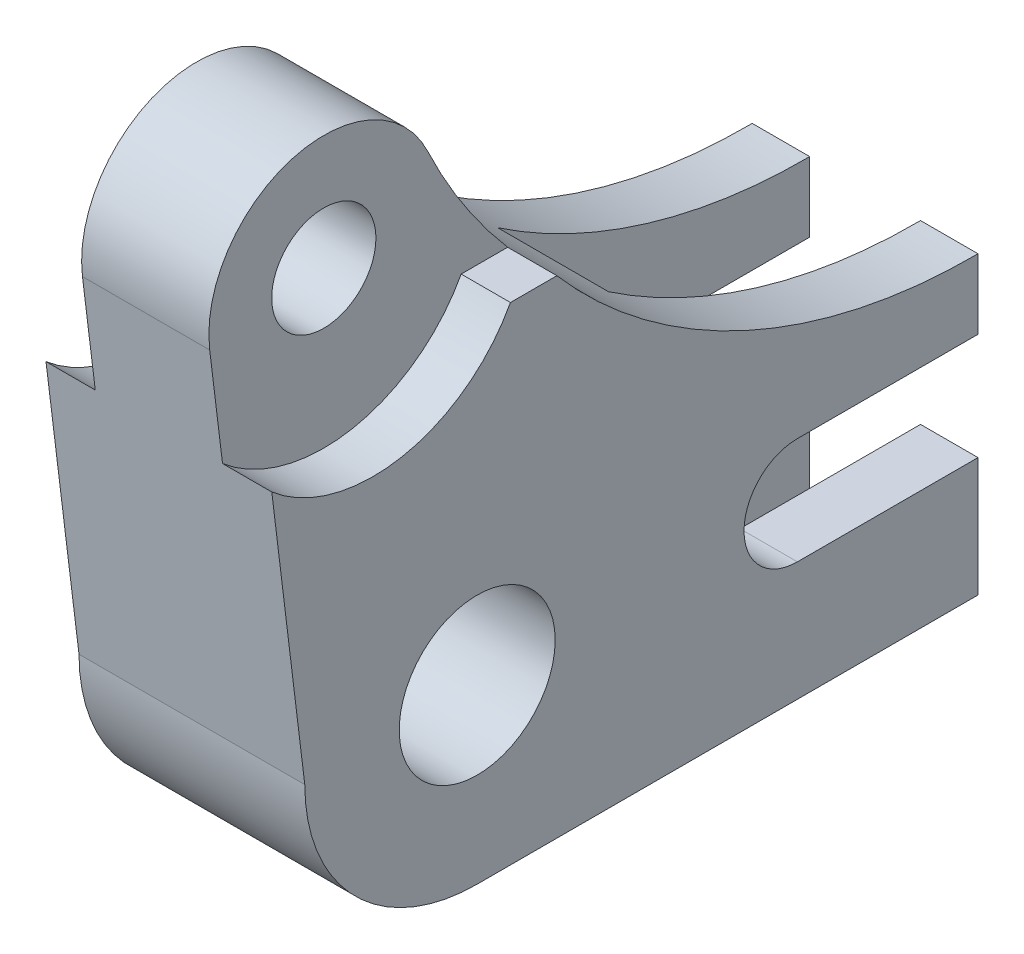
ISO-10303-21;
HEADER;
FILE_DESCRIPTION(('STEP AP214'),'2;1');
FILE_NAME('part.step','',(''),(''),'','','');
FILE_SCHEMA(('AUTOMOTIVE_DESIGN { 1 0 10303 214 1 1 1 1 }'));
ENDSEC;
DATA;
#1=APPLICATION_CONTEXT('core data for automotive mechanical design processes');
#2=APPLICATION_PROTOCOL_DEFINITION('international standard','automotive_design',2000,#1);
#3=PRODUCT_CONTEXT('',#1,'mechanical');
#4=PRODUCT('Part','Part','',(#3));
#5=PRODUCT_RELATED_PRODUCT_CATEGORY('part','',(#4));
#6=PRODUCT_DEFINITION_FORMATION('','',#4);
#7=PRODUCT_DEFINITION_CONTEXT('part definition',#1,'design');
#8=PRODUCT_DEFINITION('design','',#6,#7);
#9=PRODUCT_DEFINITION_SHAPE('','',#8);
#10=(LENGTH_UNIT() NAMED_UNIT(*) SI_UNIT(.MILLI.,.METRE.));
#11=(NAMED_UNIT(*) PLANE_ANGLE_UNIT() SI_UNIT($,.RADIAN.));
#12=(NAMED_UNIT(*) SI_UNIT($,.STERADIAN.) SOLID_ANGLE_UNIT());
#13=UNCERTAINTY_MEASURE_WITH_UNIT(LENGTH_MEASURE(1.E-05),#10,'distance_accuracy_value','');
#14=(GEOMETRIC_REPRESENTATION_CONTEXT(3) GLOBAL_UNCERTAINTY_ASSIGNED_CONTEXT((#13)) GLOBAL_UNIT_ASSIGNED_CONTEXT((#10,
#11,#12)) REPRESENTATION_CONTEXT('',''));
#15=CARTESIAN_POINT('',(0.,0.,0.));
#16=DIRECTION('',(0.,0.,1.));
#17=DIRECTION('',(1.,0.,0.));
#18=AXIS2_PLACEMENT_3D('',#15,#16,#17);
#19=CARTESIAN_POINT('',(27.5,-6.5,-61.));
#20=DIRECTION('',(0.,0.,1.));
#21=DIRECTION('',(1.,0.,0.));
#22=AXIS2_PLACEMENT_3D('',#19,#20,#21);
#23=PLANE('',#22);
#24=DIRECTION('',(0.,1.,0.));
#25=VECTOR('',#24,1.);
#26=CARTESIAN_POINT('',(7.,0.,-61.));
#27=LINE('',#26,#25);
#28=CARTESIAN_POINT('',(7.,-21.,-61.));
#29=VERTEX_POINT('',#28);
#30=CARTESIAN_POINT('',(7.,-6.5,-61.));
#31=VERTEX_POINT('',#30);
#32=EDGE_CURVE('E405',#29,#31,#27,.T.);
#33=ORIENTED_EDGE('',*,*,#32,.F.);
#34=DIRECTION('',(-1.,0.,0.));
#35=VECTOR('',#34,1.);
#36=CARTESIAN_POINT('',(27.5,-21.,-61.));
#37=LINE('',#36,#35);
#38=CARTESIAN_POINT('',(0.,-21.,-61.));
#39=VERTEX_POINT('',#38);
#40=EDGE_CURVE('E234',#29,#39,#37,.T.);
#41=ORIENTED_EDGE('',*,*,#40,.T.);
#42=DIRECTION('',(0.,1.,0.));
#43=VECTOR('',#42,1.);
#44=CARTESIAN_POINT('',(0.,-6.5,-61.));
#45=LINE('',#44,#43);
#46=CARTESIAN_POINT('',(0.,-6.5,-61.));
#47=VERTEX_POINT('',#46);
#48=EDGE_CURVE('E311',#39,#47,#45,.T.);
#49=ORIENTED_EDGE('',*,*,#48,.T.);
#50=DIRECTION('',(-1.,0.,0.));
#51=VECTOR('',#50,1.);
#52=CARTESIAN_POINT('',(27.5,-6.5,-61.));
#53=LINE('',#52,#51);
#54=EDGE_CURVE('E230',#31,#47,#53,.T.);
#55=ORIENTED_EDGE('',*,*,#54,.F.);
#56=EDGE_LOOP('',(#33,#41,#49,#55));
#57=FACE_BOUND('',#56,.T.);
#58=ADVANCED_FACE('F36',(#57),#23,.F.);
#59=CARTESIAN_POINT('',(27.5,-6.5,-39.));
#60=DIRECTION('',(0.,-1.,0.));
#61=DIRECTION('',(0.,0.,-1.));
#62=AXIS2_PLACEMENT_3D('',#59,#60,#61);
#63=PLANE('',#62);
#64=DIRECTION('',(0.,0.,1.));
#65=VECTOR('',#64,1.);
#66=CARTESIAN_POINT('',(7.,-6.5,0.));
#67=LINE('',#66,#65);
#68=CARTESIAN_POINT('',(7.,-6.5,-39.));
#69=VERTEX_POINT('',#68);
#70=EDGE_CURVE('E200',#31,#69,#67,.T.);
#71=ORIENTED_EDGE('',*,*,#70,.F.);
#72=ORIENTED_EDGE('',*,*,#54,.T.);
#73=DIRECTION('',(0.,0.,1.));
#74=VECTOR('',#73,1.);
#75=CARTESIAN_POINT('',(0.,-6.5,-39.));
#76=LINE('',#75,#74);
#77=CARTESIAN_POINT('',(0.,-6.5,-39.));
#78=VERTEX_POINT('',#77);
#79=EDGE_CURVE('E314',#47,#78,#76,.T.);
#80=ORIENTED_EDGE('',*,*,#79,.T.);
#81=DIRECTION('',(-1.,0.,0.));
#82=VECTOR('',#81,1.);
#83=CARTESIAN_POINT('',(27.5,-6.5,-39.));
#84=LINE('',#83,#82);
#85=EDGE_CURVE('E222',#69,#78,#84,.T.);
#86=ORIENTED_EDGE('',*,*,#85,.F.);
#87=EDGE_LOOP('',(#71,#72,#80,#86));
#88=FACE_BOUND('',#87,.T.);
#89=ADVANCED_FACE('F453',(#88),#63,.F.);
#90=CARTESIAN_POINT('',(27.5,0.,-39.));
#91=DIRECTION('',(-1.,0.,0.));
#92=DIRECTION('',(0.,0.,1.));
#93=AXIS2_PLACEMENT_3D('',#90,#91,#92);
#94=CYLINDRICAL_SURFACE('',#93,6.5);
#95=CARTESIAN_POINT('',(7.,0.,-39.));
#96=DIRECTION('',(1.,0.,0.));
#97=DIRECTION('',(0.,0.,-1.));
#98=AXIS2_PLACEMENT_3D('',#95,#96,#97);
#99=CIRCLE('',#98,6.5);
#100=CARTESIAN_POINT('',(7.,6.5,-39.));
#101=VERTEX_POINT('',#100);
#102=EDGE_CURVE('E197',#101,#69,#99,.T.);
#103=ORIENTED_EDGE('',*,*,#102,.T.);
#104=ORIENTED_EDGE('',*,*,#85,.T.);
#105=CARTESIAN_POINT('',(0.,0.,-39.));
#106=DIRECTION('',(-1.,0.,0.));
#107=DIRECTION('',(0.,0.,-1.));
#108=AXIS2_PLACEMENT_3D('',#105,#106,#107);
#109=CIRCLE('',#108,6.5);
#110=CARTESIAN_POINT('',(0.,6.5,-39.));
#111=VERTEX_POINT('',#110);
#112=EDGE_CURVE('E216',#78,#111,#109,.T.);
#113=ORIENTED_EDGE('',*,*,#112,.T.);
#114=DIRECTION('',(-1.,0.,0.));
#115=VECTOR('',#114,1.);
#116=CARTESIAN_POINT('',(27.5,6.5,-39.));
#117=LINE('',#116,#115);
#118=EDGE_CURVE('E209',#101,#111,#117,.T.);
#119=ORIENTED_EDGE('',*,*,#118,.F.);
#120=EDGE_LOOP('',(#103,#104,#113,#119));
#121=FACE_BOUND('',#120,.T.);
#122=ADVANCED_FACE('F214',(#121),#94,.F.);
#123=CARTESIAN_POINT('',(27.5,6.5,-39.));
#124=DIRECTION('',(0.,1.,0.));
#125=DIRECTION('',(0.,0.,1.));
#126=AXIS2_PLACEMENT_3D('',#123,#124,#125);
#127=PLANE('',#126);
#128=DIRECTION('',(0.,0.,-1.));
#129=VECTOR('',#128,1.);
#130=CARTESIAN_POINT('',(7.,6.5,0.));
#131=LINE('',#130,#129);
#132=CARTESIAN_POINT('',(7.,6.5,-61.));
#133=VERTEX_POINT('',#132);
#134=EDGE_CURVE('E52',#101,#133,#131,.T.);
#135=ORIENTED_EDGE('',*,*,#134,.F.);
#136=ORIENTED_EDGE('',*,*,#118,.T.);
#137=DIRECTION('',(0.,0.,-1.));
#138=VECTOR('',#137,1.);
#139=CARTESIAN_POINT('',(0.,6.5,-39.));
#140=LINE('',#139,#138);
#141=CARTESIAN_POINT('',(0.,6.5,-61.));
#142=VERTEX_POINT('',#141);
#143=EDGE_CURVE('E318',#111,#142,#140,.T.);
#144=ORIENTED_EDGE('',*,*,#143,.T.);
#145=DIRECTION('',(-1.,0.,0.));
#146=VECTOR('',#145,1.);
#147=CARTESIAN_POINT('',(27.5,6.5,-61.));
#148=LINE('',#147,#146);
#149=EDGE_CURVE('E211',#133,#142,#148,.T.);
#150=ORIENTED_EDGE('',*,*,#149,.F.);
#151=EDGE_LOOP('',(#135,#136,#144,#150));
#152=FACE_BOUND('',#151,.T.);
#153=ADVANCED_FACE('F207',(#152),#127,.F.);
#154=CARTESIAN_POINT('',(27.5,6.5,-61.));
#155=DIRECTION('',(0.,0.,1.));
#156=DIRECTION('',(1.,0.,0.));
#157=AXIS2_PLACEMENT_3D('',#154,#155,#156);
#158=PLANE('',#157);
#159=DIRECTION('',(0.,1.,0.));
#160=VECTOR('',#159,1.);
#161=CARTESIAN_POINT('',(7.,1.99187072065102E-13,-61.));
#162=LINE('',#161,#160);
#163=CARTESIAN_POINT('',(7.,15.,-61.));
#164=VERTEX_POINT('',#163);
#165=EDGE_CURVE('E212',#133,#164,#162,.T.);
#166=ORIENTED_EDGE('',*,*,#165,.F.);
#167=ORIENTED_EDGE('',*,*,#149,.T.);
#168=DIRECTION('',(0.,1.,0.));
#169=VECTOR('',#168,1.);
#170=CARTESIAN_POINT('',(0.,6.5,-61.));
#171=LINE('',#170,#169);
#172=CARTESIAN_POINT('',(0.,15.,-61.));
#173=VERTEX_POINT('',#172);
#174=EDGE_CURVE('E286',#142,#173,#171,.T.);
#175=ORIENTED_EDGE('',*,*,#174,.T.);
#176=DIRECTION('',(-1.,0.,0.));
#177=VECTOR('',#176,1.);
#178=CARTESIAN_POINT('',(27.5,15.,-61.));
#179=LINE('',#178,#177);
#180=EDGE_CURVE('E302',#164,#173,#179,.T.);
#181=ORIENTED_EDGE('',*,*,#180,.F.);
#182=EDGE_LOOP('',(#166,#167,#175,#181));
#183=FACE_BOUND('',#182,.T.);
#184=ADVANCED_FACE('F332',(#183),#158,.F.);
#185=CARTESIAN_POINT('',(27.5,81.9983089072166,-60.5239710374601));
#186=DIRECTION('',(-1.,0.,0.));
#187=DIRECTION('',(0.,0.,1.));
#188=AXIS2_PLACEMENT_3D('',#185,#186,#187);
#189=CYLINDRICAL_SURFACE('',#188,67.);
#190=CARTESIAN_POINT('',(27.5,15.,-61.));
#191=VERTEX_POINT('',#190);
#192=CARTESIAN_POINT('',(20.5,15.,-61.));
#193=VERTEX_POINT('',#192);
#194=EDGE_CURVE('E321',#191,#193,#179,.T.);
#195=ORIENTED_EDGE('',*,*,#194,.T.);
#196=CARTESIAN_POINT('',(20.5,81.9983089072166,-60.5239710374601));
#197=DIRECTION('',(1.,0.,0.));
#198=DIRECTION('',(0.,0.,-1.));
#199=AXIS2_PLACEMENT_3D('',#196,#197,#198);
#200=CIRCLE('',#199,67.);
#201=CARTESIAN_POINT('',(20.5,26.4919885681791,-23.));
#202=VERTEX_POINT('',#201);
#203=EDGE_CURVE('E394',#202,#193,#200,.T.);
#204=ORIENTED_EDGE('',*,*,#203,.F.);
#205=DIRECTION('',(-1.,0.,0.));
#206=VECTOR('',#205,1.);
#207=CARTESIAN_POINT('',(20.5,26.4919885681791,-23.));
#208=LINE('',#207,#206);
#209=CARTESIAN_POINT('',(7.,26.4919885681791,-23.));
#210=VERTEX_POINT('',#209);
#211=EDGE_CURVE('E363',#202,#210,#208,.T.);
#212=ORIENTED_EDGE('',*,*,#211,.T.);
#213=CARTESIAN_POINT('',(7.,81.9983089072166,-60.5239710374601));
#214=DIRECTION('',(1.,0.,0.));
#215=DIRECTION('',(0.,0.,-1.));
#216=AXIS2_PLACEMENT_3D('',#213,#214,#215);
#217=CIRCLE('',#216,67.);
#218=EDGE_CURVE('E329',#210,#164,#217,.T.);
#219=ORIENTED_EDGE('',*,*,#218,.T.);
#220=ORIENTED_EDGE('',*,*,#180,.T.);
#221=CARTESIAN_POINT('',(0.,81.9983089072166,-60.5239710374601));
#222=DIRECTION('',(-1.,0.,0.));
#223=DIRECTION('',(0.,0.,-1.));
#224=AXIS2_PLACEMENT_3D('',#221,#222,#223);
#225=CIRCLE('',#224,67.);
#226=CARTESIAN_POINT('',(0.,38.3303654881644,-9.70949753285262));
#227=VERTEX_POINT('',#226);
#228=EDGE_CURVE('E278',#173,#227,#225,.T.);
#229=ORIENTED_EDGE('',*,*,#228,.T.);
#230=DIRECTION('',(1.,0.,0.));
#231=VECTOR('',#230,1.);
#232=CARTESIAN_POINT('',(-188.60036050004,38.3303654881644,-9.70949753285262));
#233=LINE('',#232,#231);
#234=CARTESIAN_POINT('',(6.,38.3303654881644,-9.70949753285262));
#235=VERTEX_POINT('',#234);
#236=EDGE_CURVE('E267',#227,#235,#233,.T.);
#237=ORIENTED_EDGE('',*,*,#236,.T.);
#238=CARTESIAN_POINT('',(6.,81.9983089072166,-60.5239710374601));
#239=DIRECTION('',(-1.,0.,0.));
#240=DIRECTION('',(0.,0.,-1.));
#241=AXIS2_PLACEMENT_3D('',#238,#239,#240);
#242=CIRCLE('',#241,67.);
#243=CARTESIAN_POINT('',(6.,53.3223557087413,0.029226303050793));
#244=VERTEX_POINT('',#243);
#245=EDGE_CURVE('E257',#235,#244,#242,.T.);
#246=ORIENTED_EDGE('',*,*,#245,.T.);
#247=DIRECTION('',(-1.,0.,0.));
#248=VECTOR('',#247,1.);
#249=CARTESIAN_POINT('',(27.5,53.3223557087413,0.029226303050793));
#250=LINE('',#249,#248);
#251=CARTESIAN_POINT('',(21.5,53.3223557087413,0.029226303050793));
#252=VERTEX_POINT('',#251);
#253=EDGE_CURVE('E45',#252,#244,#250,.T.);
#254=ORIENTED_EDGE('',*,*,#253,.F.);
#255=CARTESIAN_POINT('',(21.5,81.9983089072166,-60.5239710374601));
#256=DIRECTION('',(-1.,0.,0.));
#257=DIRECTION('',(0.,0.,-1.));
#258=AXIS2_PLACEMENT_3D('',#255,#256,#257);
#259=CIRCLE('',#258,67.);
#260=CARTESIAN_POINT('',(21.5,38.3303654881644,-9.70949753285261));
#261=VERTEX_POINT('',#260);
#262=EDGE_CURVE('E60',#261,#252,#259,.T.);
#263=ORIENTED_EDGE('',*,*,#262,.F.);
#264=DIRECTION('',(-1.,0.,0.));
#265=VECTOR('',#264,1.);
#266=CARTESIAN_POINT('',(216.10036050004,38.3303654881644,-9.70949753285262));
#267=LINE('',#266,#265);
#268=CARTESIAN_POINT('',(27.5,38.3303654881644,-9.70949753285261));
#269=VERTEX_POINT('',#268);
#270=EDGE_CURVE('E370',#269,#261,#267,.T.);
#271=ORIENTED_EDGE('',*,*,#270,.F.);
#272=CARTESIAN_POINT('',(27.5,81.9983089072166,-60.5239710374601));
#273=DIRECTION('',(-1.,0.,0.));
#274=DIRECTION('',(0.,0.,-1.));
#275=AXIS2_PLACEMENT_3D('',#272,#273,#274);
#276=CIRCLE('',#275,67.);
#277=EDGE_CURVE('E282',#191,#269,#276,.T.);
#278=ORIENTED_EDGE('',*,*,#277,.F.);
#279=EDGE_LOOP('',(#195,#204,#212,#219,#220,#229,#237,#246,#254,#263,#271,#278));
#280=FACE_BOUND('',#279,.T.);
#281=ADVANCED_FACE('F38',(#280),#189,.F.);
#282=CARTESIAN_POINT('',(27.5,45.6314460768883,26.5786677720638));
#283=DIRECTION('',(0.,0.121351386519726,-0.992609611574329));
#284=DIRECTION('',(0.,0.992609611574329,0.121351386519726));
#285=AXIS2_PLACEMENT_3D('',#282,#283,#284);
#286=PLANE('',#285);
#287=DIRECTION('',(-1.,0.,0.));
#288=VECTOR('',#287,1.);
#289=CARTESIAN_POINT('',(216.10036050004,32.8811447563976,25.0198809884745));
#290=LINE('',#289,#288);
#291=CARTESIAN_POINT('',(27.5,32.8811447563976,25.0198809884745));
#292=VERTEX_POINT('',#291);
#293=CARTESIAN_POINT('',(21.5,32.8811447563976,25.0198809884745));
#294=VERTEX_POINT('',#293);
#295=EDGE_CURVE('E373',#292,#294,#290,.T.);
#296=ORIENTED_EDGE('',*,*,#295,.T.);
#297=DIRECTION('',(0.,-0.992609611574329,-0.121351386519726));
#298=VECTOR('',#297,1.);
#299=CARTESIAN_POINT('',(21.5,45.6314460768883,26.5786677720638));
#300=LINE('',#299,#298);
#301=CARTESIAN_POINT('',(21.5,45.6314460768883,26.5786677720638));
#302=VERTEX_POINT('',#301);
#303=EDGE_CURVE('E357',#302,#294,#300,.T.);
#304=ORIENTED_EDGE('',*,*,#303,.F.);
#305=DIRECTION('',(-1.,0.,0.));
#306=VECTOR('',#305,1.);
#307=CARTESIAN_POINT('',(27.5,45.6314460768883,26.5786677720638));
#308=LINE('',#307,#306);
#309=CARTESIAN_POINT('',(6.,45.6314460768883,26.5786677720638));
#310=VERTEX_POINT('',#309);
#311=EDGE_CURVE('E244',#302,#310,#308,.T.);
#312=ORIENTED_EDGE('',*,*,#311,.T.);
#313=DIRECTION('',(0.,-0.992609611574329,-0.121351386519726));
#314=VECTOR('',#313,1.);
#315=CARTESIAN_POINT('',(6.,45.6314460768883,26.5786677720638));
#316=LINE('',#315,#314);
#317=CARTESIAN_POINT('',(6.00000000000001,32.8811447563976,25.0198809884745));
#318=VERTEX_POINT('',#317);
#319=EDGE_CURVE('E261',#310,#318,#316,.T.);
#320=ORIENTED_EDGE('',*,*,#319,.T.);
#321=DIRECTION('',(1.,0.,0.));
#322=VECTOR('',#321,1.);
#323=CARTESIAN_POINT('',(-188.60036050004,32.8811447563975,25.0198809884745));
#324=LINE('',#323,#322);
#325=CARTESIAN_POINT('',(0.,32.8811447563975,25.0198809884745));
#326=VERTEX_POINT('',#325);
#327=EDGE_CURVE('E348',#326,#318,#324,.T.);
#328=ORIENTED_EDGE('',*,*,#327,.F.);
#329=DIRECTION('',(0.,-0.992609611574329,-0.121351386519726));
#330=VECTOR('',#329,1.);
#331=CARTESIAN_POINT('',(0.,45.6314460768883,26.5786677720638));
#332=LINE('',#331,#330);
#333=CARTESIAN_POINT('',(0.,0.,21.));
#334=VERTEX_POINT('',#333);
#335=EDGE_CURVE('E304',#326,#334,#332,.T.);
#336=ORIENTED_EDGE('',*,*,#335,.T.);
#337=DIRECTION('',(-1.,0.,0.));
#338=VECTOR('',#337,1.);
#339=CARTESIAN_POINT('',(27.5,0.,21.));
#340=LINE('',#339,#338);
#341=CARTESIAN_POINT('',(27.5,0.,21.));
#342=VERTEX_POINT('',#341);
#343=EDGE_CURVE('E241',#342,#334,#340,.T.);
#344=ORIENTED_EDGE('',*,*,#343,.F.);
#345=DIRECTION('',(0.,-0.992609611574329,-0.121351386519726));
#346=VECTOR('',#345,1.);
#347=CARTESIAN_POINT('',(27.5,45.6314460768883,26.5786677720638));
#348=LINE('',#347,#346);
#349=EDGE_CURVE('E285',#292,#342,#348,.T.);
#350=ORIENTED_EDGE('',*,*,#349,.F.);
#351=EDGE_LOOP('',(#296,#304,#312,#320,#328,#336,#344,#350));
#352=FACE_BOUND('',#351,.T.);
#353=ADVANCED_FACE('F463',(#352),#286,.F.);
#354=CARTESIAN_POINT('',(27.5,81.9983089072166,-60.5239710374601));
#355=DIRECTION('',(1.,0.,0.));
#356=DIRECTION('',(0.,0.,-1.));
#357=AXIS2_PLACEMENT_3D('',#354,#355,#356);
#358=PLANE('',#357);
#359=CARTESIAN_POINT('',(27.5,0.,0.));
#360=DIRECTION('',(1.,0.,0.));
#361=DIRECTION('',(0.,0.,-1.));
#362=AXIS2_PLACEMENT_3D('',#359,#360,#361);
#363=CIRCLE('',#362,9.5);
#364=CARTESIAN_POINT('',(27.5,0.,-9.5));
#365=VERTEX_POINT('',#364);
#366=EDGE_CURVE('E275',#365,#365,#363,.T.);
#367=ORIENTED_EDGE('',*,*,#366,.F.);
#368=EDGE_LOOP('',(#367));
#369=FACE_BOUND('',#368,.T.);
#370=ORIENTED_EDGE('',*,*,#277,.T.);
#371=DIRECTION('',(0.,0.,-1.));
#372=VECTOR('',#371,1.);
#373=CARTESIAN_POINT('',(27.5,38.3303654881644,-4.05106732065829));
#374=LINE('',#373,#372);
#375=CARTESIAN_POINT('',(27.5,38.3303654881644,-4.05106732065828));
#376=VERTEX_POINT('',#375);
#377=EDGE_CURVE('E364',#376,#269,#374,.T.);
#378=ORIENTED_EDGE('',*,*,#377,.F.);
#379=CARTESIAN_POINT('',(27.5,47.3303654881644,12.6821332100232));
#380=DIRECTION('',(1.,0.,0.));
#381=DIRECTION('',(0.,0.,-1.));
#382=AXIS2_PLACEMENT_3D('',#379,#380,#381);
#383=CIRCLE('',#382,19.);
#384=EDGE_CURVE('E271',#292,#376,#383,.T.);
#385=ORIENTED_EDGE('',*,*,#384,.F.);
#386=ORIENTED_EDGE('',*,*,#349,.T.);
#387=CARTESIAN_POINT('',(27.5,0.,0.));
#388=DIRECTION('',(1.,0.,0.));
#389=DIRECTION('',(0.,0.,-1.));
#390=AXIS2_PLACEMENT_3D('',#387,#388,#389);
#391=CIRCLE('',#390,21.);
#392=CARTESIAN_POINT('',(27.5,-21.,0.));
#393=VERTEX_POINT('',#392);
#394=EDGE_CURVE('E288',#342,#393,#391,.T.);
#395=ORIENTED_EDGE('',*,*,#394,.T.);
#396=DIRECTION('',(0.,0.,-1.));
#397=VECTOR('',#396,1.);
#398=CARTESIAN_POINT('',(27.5,-21.,0.));
#399=LINE('',#398,#397);
#400=CARTESIAN_POINT('',(27.5,-21.,-61.));
#401=VERTEX_POINT('',#400);
#402=EDGE_CURVE('E290',#393,#401,#399,.T.);
#403=ORIENTED_EDGE('',*,*,#402,.T.);
#404=DIRECTION('',(0.,1.,0.));
#405=VECTOR('',#404,1.);
#406=CARTESIAN_POINT('',(27.5,-6.5,-61.));
#407=LINE('',#406,#405);
#408=CARTESIAN_POINT('',(27.5,-6.5,-61.));
#409=VERTEX_POINT('',#408);
#410=EDGE_CURVE('E292',#401,#409,#407,.T.);
#411=ORIENTED_EDGE('',*,*,#410,.T.);
#412=DIRECTION('',(0.,0.,1.));
#413=VECTOR('',#412,1.);
#414=CARTESIAN_POINT('',(27.5,-6.5,-39.));
#415=LINE('',#414,#413);
#416=CARTESIAN_POINT('',(27.5,-6.5,-39.));
#417=VERTEX_POINT('',#416);
#418=EDGE_CURVE('E294',#409,#417,#415,.T.);
#419=ORIENTED_EDGE('',*,*,#418,.T.);
#420=CARTESIAN_POINT('',(27.5,0.,-39.));
#421=DIRECTION('',(-1.,0.,0.));
#422=DIRECTION('',(0.,0.,-1.));
#423=AXIS2_PLACEMENT_3D('',#420,#421,#422);
#424=CIRCLE('',#423,6.5);
#425=CARTESIAN_POINT('',(27.5,6.5,-39.));
#426=VERTEX_POINT('',#425);
#427=EDGE_CURVE('E296',#417,#426,#424,.T.);
#428=ORIENTED_EDGE('',*,*,#427,.T.);
#429=DIRECTION('',(0.,0.,-1.));
#430=VECTOR('',#429,1.);
#431=CARTESIAN_POINT('',(27.5,6.5,-39.));
#432=LINE('',#431,#430);
#433=CARTESIAN_POINT('',(27.5,6.5,-61.));
#434=VERTEX_POINT('',#433);
#435=EDGE_CURVE('E298',#426,#434,#432,.T.);
#436=ORIENTED_EDGE('',*,*,#435,.T.);
#437=DIRECTION('',(0.,1.,0.));
#438=VECTOR('',#437,1.);
#439=CARTESIAN_POINT('',(27.5,6.5,-61.));
#440=LINE('',#439,#438);
#441=EDGE_CURVE('E300',#434,#191,#440,.T.);
#442=ORIENTED_EDGE('',*,*,#441,.T.);
#443=EDGE_LOOP('',(#370,#378,#385,#386,#395,#403,#411,#419,#428,#436,#442));
#444=FACE_BOUND('',#443,.T.);
#445=ADVANCED_FACE('F474',(#369,#444),#358,.T.);
#446=CARTESIAN_POINT('',(27.5,47.3303654881644,12.6821332100232));
#447=DIRECTION('',(-1.,0.,0.));
#448=DIRECTION('',(0.,0.,1.));
#449=AXIS2_PLACEMENT_3D('',#446,#447,#448);
#450=CYLINDRICAL_SURFACE('',#449,14.);
#451=CARTESIAN_POINT('',(21.5,47.3303654881644,12.6821332100232));
#452=DIRECTION('',(1.,0.,0.));
#453=DIRECTION('',(0.,0.,-1.));
#454=AXIS2_PLACEMENT_3D('',#451,#452,#453);
#455=CIRCLE('',#454,14.);
#456=EDGE_CURVE('E252',#252,#302,#455,.T.);
#457=ORIENTED_EDGE('',*,*,#456,.F.);
#458=ORIENTED_EDGE('',*,*,#253,.T.);
#459=CARTESIAN_POINT('',(6.,47.3303654881644,12.6821332100232));
#460=DIRECTION('',(1.,0.,0.));
#461=DIRECTION('',(0.,0.,-1.));
#462=AXIS2_PLACEMENT_3D('',#459,#460,#461);
#463=CIRCLE('',#462,14.);
#464=EDGE_CURVE('E250',#244,#310,#463,.T.);
#465=ORIENTED_EDGE('',*,*,#464,.T.);
#466=ORIENTED_EDGE('',*,*,#311,.F.);
#467=EDGE_LOOP('',(#457,#458,#465,#466));
#468=FACE_BOUND('',#467,.T.);
#469=ADVANCED_FACE('F249',(#468),#450,.T.);
#470=CARTESIAN_POINT('',(27.5,47.3303654881644,12.6821332100232));
#471=DIRECTION('',(-1.,0.,0.));
#472=DIRECTION('',(0.,0.,1.));
#473=AXIS2_PLACEMENT_3D('',#470,#471,#472);
#474=CYLINDRICAL_SURFACE('',#473,6.35);
#475=CARTESIAN_POINT('',(6.,47.3303654881644,12.6821332100232));
#476=DIRECTION('',(1.,0.,0.));
#477=DIRECTION('',(0.,0.,-1.));
#478=AXIS2_PLACEMENT_3D('',#475,#476,#477);
#479=CIRCLE('',#478,6.35);
#480=CARTESIAN_POINT('',(6.,47.3303654881644,6.33213321002322));
#481=VERTEX_POINT('',#480);
#482=EDGE_CURVE('E11',#481,#481,#479,.T.);
#483=ORIENTED_EDGE('',*,*,#482,.F.);
#484=EDGE_LOOP('',(#483));
#485=FACE_BOUND('',#484,.T.);
#486=CARTESIAN_POINT('',(21.5,47.3303654881644,12.6821332100232));
#487=DIRECTION('',(1.,0.,0.));
#488=DIRECTION('',(0.,0.,-1.));
#489=AXIS2_PLACEMENT_3D('',#486,#487,#488);
#490=CIRCLE('',#489,6.35);
#491=CARTESIAN_POINT('',(21.5,47.3303654881644,6.33213321002322));
#492=VERTEX_POINT('',#491);
#493=EDGE_CURVE('E40',#492,#492,#490,.T.);
#494=ORIENTED_EDGE('',*,*,#493,.T.);
#495=EDGE_LOOP('',(#494));
#496=FACE_BOUND('',#495,.T.);
#497=ADVANCED_FACE('F505',(#485,#496),#474,.F.);
#498=CARTESIAN_POINT('',(0.,81.9983089072166,-60.5239710374601));
#499=DIRECTION('',(1.,0.,0.));
#500=DIRECTION('',(0.,0.,-1.));
#501=AXIS2_PLACEMENT_3D('',#498,#499,#500);
#502=PLANE('',#501);
#503=CARTESIAN_POINT('',(0.,0.,0.));
#504=DIRECTION('',(1.,0.,0.));
#505=DIRECTION('',(0.,0.,-1.));
#506=AXIS2_PLACEMENT_3D('',#503,#504,#505);
#507=CIRCLE('',#506,9.5);
#508=CARTESIAN_POINT('',(0.,0.,-9.5));
#509=VERTEX_POINT('',#508);
#510=EDGE_CURVE('E279',#509,#509,#507,.T.);
#511=ORIENTED_EDGE('',*,*,#510,.T.);
#512=EDGE_LOOP('',(#511));
#513=FACE_BOUND('',#512,.T.);
#514=DIRECTION('',(0.,0.,-1.));
#515=VECTOR('',#514,1.);
#516=CARTESIAN_POINT('',(0.,38.3303654881644,-9.70949753285262));
#517=LINE('',#516,#515);
#518=CARTESIAN_POINT('',(0.,38.3303654881644,-4.05106732065829));
#519=VERTEX_POINT('',#518);
#520=EDGE_CURVE('E262',#519,#227,#517,.T.);
#521=ORIENTED_EDGE('',*,*,#520,.T.);
#522=ORIENTED_EDGE('',*,*,#228,.F.);
#523=ORIENTED_EDGE('',*,*,#174,.F.);
#524=ORIENTED_EDGE('',*,*,#143,.F.);
#525=ORIENTED_EDGE('',*,*,#112,.F.);
#526=ORIENTED_EDGE('',*,*,#79,.F.);
#527=ORIENTED_EDGE('',*,*,#48,.F.);
#528=DIRECTION('',(0.,0.,-1.));
#529=VECTOR('',#528,1.);
#530=CARTESIAN_POINT('',(0.,-21.,0.));
#531=LINE('',#530,#529);
#532=CARTESIAN_POINT('',(0.,-21.,0.));
#533=VERTEX_POINT('',#532);
#534=EDGE_CURVE('E308',#533,#39,#531,.T.);
#535=ORIENTED_EDGE('',*,*,#534,.F.);
#536=CARTESIAN_POINT('',(0.,0.,0.));
#537=DIRECTION('',(1.,0.,0.));
#538=DIRECTION('',(0.,0.,-1.));
#539=AXIS2_PLACEMENT_3D('',#536,#537,#538);
#540=CIRCLE('',#539,21.);
#541=EDGE_CURVE('E306',#334,#533,#540,.T.);
#542=ORIENTED_EDGE('',*,*,#541,.F.);
#543=ORIENTED_EDGE('',*,*,#335,.F.);
#544=CARTESIAN_POINT('',(0.,47.3303654881644,12.6821332100232));
#545=DIRECTION('',(1.,0.,0.));
#546=DIRECTION('',(0.,0.,-1.));
#547=AXIS2_PLACEMENT_3D('',#544,#545,#546);
#548=CIRCLE('',#547,19.);
#549=EDGE_CURVE('E338',#326,#519,#548,.T.);
#550=ORIENTED_EDGE('',*,*,#549,.T.);
#551=EDGE_LOOP('',(#521,#522,#523,#524,#525,#526,#527,#535,#542,#543,#550));
#552=FACE_BOUND('',#551,.T.);
#553=ADVANCED_FACE('F335',(#513,#552),#502,.F.);
#554=CARTESIAN_POINT('',(27.5,0.,0.));
#555=DIRECTION('',(-1.,0.,0.));
#556=DIRECTION('',(0.,0.,1.));
#557=AXIS2_PLACEMENT_3D('',#554,#555,#556);
#558=CYLINDRICAL_SURFACE('',#557,21.);
#559=ORIENTED_EDGE('',*,*,#541,.T.);
#560=DIRECTION('',(-1.,0.,0.));
#561=VECTOR('',#560,1.);
#562=CARTESIAN_POINT('',(27.5,-21.,0.));
#563=LINE('',#562,#561);
#564=EDGE_CURVE('E238',#393,#533,#563,.T.);
#565=ORIENTED_EDGE('',*,*,#564,.F.);
#566=ORIENTED_EDGE('',*,*,#394,.F.);
#567=ORIENTED_EDGE('',*,*,#343,.T.);
#568=EDGE_LOOP('',(#559,#565,#566,#567));
#569=FACE_BOUND('',#568,.T.);
#570=ADVANCED_FACE('F459',(#569),#558,.T.);
#571=CARTESIAN_POINT('',(27.5,-21.,0.));
#572=DIRECTION('',(0.,1.,0.));
#573=DIRECTION('',(0.,0.,1.));
#574=AXIS2_PLACEMENT_3D('',#571,#572,#573);
#575=PLANE('',#574);
#576=DIRECTION('',(-1.,0.,0.));
#577=VECTOR('',#576,1.);
#578=CARTESIAN_POINT('',(20.5,-21.,-23.));
#579=LINE('',#578,#577);
#580=CARTESIAN_POINT('',(20.5,-21.,-23.));
#581=VERTEX_POINT('',#580);
#582=CARTESIAN_POINT('',(7.,-21.,-23.));
#583=VERTEX_POINT('',#582);
#584=EDGE_CURVE('E381',#581,#583,#579,.T.);
#585=ORIENTED_EDGE('',*,*,#584,.F.);
#586=DIRECTION('',(0.,0.,-1.));
#587=VECTOR('',#586,1.);
#588=CARTESIAN_POINT('',(20.5,-21.,0.));
#589=LINE('',#588,#587);
#590=CARTESIAN_POINT('',(20.5,-21.,-61.));
#591=VERTEX_POINT('',#590);
#592=EDGE_CURVE('E389',#581,#591,#589,.T.);
#593=ORIENTED_EDGE('',*,*,#592,.T.);
#594=EDGE_CURVE('E235',#401,#591,#37,.T.);
#595=ORIENTED_EDGE('',*,*,#594,.F.);
#596=ORIENTED_EDGE('',*,*,#402,.F.);
#597=ORIENTED_EDGE('',*,*,#564,.T.);
#598=ORIENTED_EDGE('',*,*,#534,.T.);
#599=ORIENTED_EDGE('',*,*,#40,.F.);
#600=DIRECTION('',(0.,0.,-1.));
#601=VECTOR('',#600,1.);
#602=CARTESIAN_POINT('',(7.,-21.,0.));
#603=LINE('',#602,#601);
#604=EDGE_CURVE('E407',#583,#29,#603,.T.);
#605=ORIENTED_EDGE('',*,*,#604,.F.);
#606=EDGE_LOOP('',(#585,#593,#595,#596,#597,#598,#599,#605));
#607=FACE_BOUND('',#606,.T.);
#608=ADVANCED_FACE('F445',(#607),#575,.F.);
#609=ORIENTED_EDGE('',*,*,#594,.T.);
#610=DIRECTION('',(0.,1.,0.));
#611=VECTOR('',#610,1.);
#612=CARTESIAN_POINT('',(20.5,0.,-61.));
#613=LINE('',#612,#611);
#614=CARTESIAN_POINT('',(20.5,-6.5,-61.));
#615=VERTEX_POINT('',#614);
#616=EDGE_CURVE('E386',#591,#615,#613,.T.);
#617=ORIENTED_EDGE('',*,*,#616,.T.);
#618=EDGE_CURVE('E231',#409,#615,#53,.T.);
#619=ORIENTED_EDGE('',*,*,#618,.F.);
#620=ORIENTED_EDGE('',*,*,#410,.F.);
#621=EDGE_LOOP('',(#609,#617,#619,#620));
#622=FACE_BOUND('',#621,.T.);
#623=ADVANCED_FACE('F440',(#622),#23,.F.);
#624=ORIENTED_EDGE('',*,*,#618,.T.);
#625=DIRECTION('',(0.,0.,1.));
#626=VECTOR('',#625,1.);
#627=CARTESIAN_POINT('',(20.5,-6.5,0.));
#628=LINE('',#627,#626);
#629=CARTESIAN_POINT('',(20.5,-6.5,-39.));
#630=VERTEX_POINT('',#629);
#631=EDGE_CURVE('E383',#615,#630,#628,.T.);
#632=ORIENTED_EDGE('',*,*,#631,.T.);
#633=EDGE_CURVE('E227',#417,#630,#84,.T.);
#634=ORIENTED_EDGE('',*,*,#633,.F.);
#635=ORIENTED_EDGE('',*,*,#418,.F.);
#636=EDGE_LOOP('',(#624,#632,#634,#635));
#637=FACE_BOUND('',#636,.T.);
#638=ADVANCED_FACE('F437',(#637),#63,.F.);
#639=ORIENTED_EDGE('',*,*,#633,.T.);
#640=CARTESIAN_POINT('',(20.5,0.,-39.));
#641=DIRECTION('',(1.,0.,0.));
#642=DIRECTION('',(0.,0.,-1.));
#643=AXIS2_PLACEMENT_3D('',#640,#641,#642);
#644=CIRCLE('',#643,6.5);
#645=CARTESIAN_POINT('',(20.5,6.5,-39.));
#646=VERTEX_POINT('',#645);
#647=EDGE_CURVE('E402',#646,#630,#644,.T.);
#648=ORIENTED_EDGE('',*,*,#647,.F.);
#649=EDGE_CURVE('E218',#426,#646,#117,.T.);
#650=ORIENTED_EDGE('',*,*,#649,.F.);
#651=ORIENTED_EDGE('',*,*,#427,.F.);
#652=EDGE_LOOP('',(#639,#648,#650,#651));
#653=FACE_BOUND('',#652,.T.);
#654=ADVANCED_FACE('F432',(#653),#94,.F.);
#655=ORIENTED_EDGE('',*,*,#649,.T.);
#656=DIRECTION('',(0.,0.,-1.));
#657=VECTOR('',#656,1.);
#658=CARTESIAN_POINT('',(20.5,6.5,0.));
#659=LINE('',#658,#657);
#660=CARTESIAN_POINT('',(20.5,6.5,-61.));
#661=VERTEX_POINT('',#660);
#662=EDGE_CURVE('E399',#646,#661,#659,.T.);
#663=ORIENTED_EDGE('',*,*,#662,.T.);
#664=EDGE_CURVE('E219',#434,#661,#148,.T.);
#665=ORIENTED_EDGE('',*,*,#664,.F.);
#666=ORIENTED_EDGE('',*,*,#435,.F.);
#667=EDGE_LOOP('',(#655,#663,#665,#666));
#668=FACE_BOUND('',#667,.T.);
#669=ADVANCED_FACE('F428',(#668),#127,.F.);
#670=ORIENTED_EDGE('',*,*,#664,.T.);
#671=DIRECTION('',(0.,1.,0.));
#672=VECTOR('',#671,1.);
#673=CARTESIAN_POINT('',(20.5,1.99187072065102E-13,-61.));
#674=LINE('',#673,#672);
#675=EDGE_CURVE('E396',#661,#193,#674,.T.);
#676=ORIENTED_EDGE('',*,*,#675,.T.);
#677=ORIENTED_EDGE('',*,*,#194,.F.);
#678=ORIENTED_EDGE('',*,*,#441,.F.);
#679=EDGE_LOOP('',(#670,#676,#677,#678));
#680=FACE_BOUND('',#679,.T.);
#681=ADVANCED_FACE('F423',(#680),#158,.F.);
#682=CARTESIAN_POINT('',(27.5,0.,0.));
#683=DIRECTION('',(-1.,0.,0.));
#684=DIRECTION('',(0.,0.,1.));
#685=AXIS2_PLACEMENT_3D('',#682,#683,#684);
#686=CYLINDRICAL_SURFACE('',#685,9.5);
#687=ORIENTED_EDGE('',*,*,#366,.T.);
#688=EDGE_LOOP('',(#687));
#689=FACE_BOUND('',#688,.T.);
#690=ORIENTED_EDGE('',*,*,#510,.F.);
#691=EDGE_LOOP('',(#690));
#692=FACE_BOUND('',#691,.T.);
#693=ADVANCED_FACE('F519',(#689,#692),#686,.F.);
#694=CARTESIAN_POINT('',(-188.60036050004,38.3303654881644,-9.70949753285262));
#695=DIRECTION('',(0.,1.,0.));
#696=DIRECTION('',(0.,0.,1.));
#697=AXIS2_PLACEMENT_3D('',#694,#695,#696);
#698=PLANE('',#697);
#699=ORIENTED_EDGE('',*,*,#520,.F.);
#700=DIRECTION('',(1.,0.,0.));
#701=VECTOR('',#700,1.);
#702=CARTESIAN_POINT('',(-188.60036050004,38.3303654881644,-4.05106732065829));
#703=LINE('',#702,#701);
#704=CARTESIAN_POINT('',(6.,38.3303654881644,-4.05106732065829));
#705=VERTEX_POINT('',#704);
#706=EDGE_CURVE('E349',#519,#705,#703,.T.);
#707=ORIENTED_EDGE('',*,*,#706,.T.);
#708=DIRECTION('',(0.,0.,-1.));
#709=VECTOR('',#708,1.);
#710=CARTESIAN_POINT('',(6.00000000000001,38.3303654881644,-9.70949753285262));
#711=LINE('',#710,#709);
#712=EDGE_CURVE('E350',#705,#235,#711,.T.);
#713=ORIENTED_EDGE('',*,*,#712,.T.);
#714=ORIENTED_EDGE('',*,*,#236,.F.);
#715=EDGE_LOOP('',(#699,#707,#713,#714));
#716=FACE_BOUND('',#715,.T.);
#717=ADVANCED_FACE('F351',(#716),#698,.T.);
#718=CARTESIAN_POINT('',(-188.60036050004,47.3303654881644,12.6821332100232));
#719=DIRECTION('',(1.,0.,0.));
#720=DIRECTION('',(0.,0.,-1.));
#721=AXIS2_PLACEMENT_3D('',#718,#719,#720);
#722=CYLINDRICAL_SURFACE('',#721,19.);
#723=ORIENTED_EDGE('',*,*,#549,.F.);
#724=ORIENTED_EDGE('',*,*,#327,.T.);
#725=CARTESIAN_POINT('',(6.00000000000001,47.3303654881644,12.6821332100232));
#726=DIRECTION('',(1.,0.,0.));
#727=DIRECTION('',(0.,0.,-1.));
#728=AXIS2_PLACEMENT_3D('',#725,#726,#727);
#729=CIRCLE('',#728,19.);
#730=EDGE_CURVE('E343',#318,#705,#729,.T.);
#731=ORIENTED_EDGE('',*,*,#730,.T.);
#732=ORIENTED_EDGE('',*,*,#706,.F.);
#733=EDGE_LOOP('',(#723,#724,#731,#732));
#734=FACE_BOUND('',#733,.T.);
#735=ADVANCED_FACE('F354',(#734),#722,.F.);
#736=CARTESIAN_POINT('',(6.,81.9983089072166,-60.5239710374601));
#737=DIRECTION('',(1.,0.,0.));
#738=DIRECTION('',(0.,0.,-1.));
#739=AXIS2_PLACEMENT_3D('',#736,#737,#738);
#740=PLANE('',#739);
#741=ORIENTED_EDGE('',*,*,#482,.T.);
#742=EDGE_LOOP('',(#741));
#743=FACE_BOUND('',#742,.T.);
#744=ORIENTED_EDGE('',*,*,#712,.F.);
#745=ORIENTED_EDGE('',*,*,#730,.F.);
#746=ORIENTED_EDGE('',*,*,#319,.F.);
#747=ORIENTED_EDGE('',*,*,#464,.F.);
#748=ORIENTED_EDGE('',*,*,#245,.F.);
#749=EDGE_LOOP('',(#744,#745,#746,#747,#748));
#750=FACE_BOUND('',#749,.T.);
#751=ADVANCED_FACE('F256',(#743,#750),#740,.F.);
#752=CARTESIAN_POINT('',(216.10036050004,38.3303654881644,-4.05106732065829));
#753=DIRECTION('',(0.,1.,0.));
#754=DIRECTION('',(0.,0.,1.));
#755=AXIS2_PLACEMENT_3D('',#752,#753,#754);
#756=PLANE('',#755);
#757=DIRECTION('',(-1.,0.,0.));
#758=VECTOR('',#757,1.);
#759=CARTESIAN_POINT('',(216.10036050004,38.3303654881644,-4.05106732065828));
#760=LINE('',#759,#758);
#761=CARTESIAN_POINT('',(21.5,38.3303654881644,-4.05106732065828));
#762=VERTEX_POINT('',#761);
#763=EDGE_CURVE('E367',#376,#762,#760,.T.);
#764=ORIENTED_EDGE('',*,*,#763,.F.);
#765=ORIENTED_EDGE('',*,*,#377,.T.);
#766=ORIENTED_EDGE('',*,*,#270,.T.);
#767=DIRECTION('',(0.,0.,-1.));
#768=VECTOR('',#767,1.);
#769=CARTESIAN_POINT('',(21.5,38.3303654881644,-4.05106732065829));
#770=LINE('',#769,#768);
#771=EDGE_CURVE('E375',#762,#261,#770,.T.);
#772=ORIENTED_EDGE('',*,*,#771,.F.);
#773=EDGE_LOOP('',(#764,#765,#766,#772));
#774=FACE_BOUND('',#773,.T.);
#775=ADVANCED_FACE('F472',(#774),#756,.T.);
#776=CARTESIAN_POINT('',(216.10036050004,47.3303654881644,12.6821332100232));
#777=DIRECTION('',(-1.,0.,0.));
#778=DIRECTION('',(0.,0.,1.));
#779=AXIS2_PLACEMENT_3D('',#776,#777,#778);
#780=CYLINDRICAL_SURFACE('',#779,19.);
#781=ORIENTED_EDGE('',*,*,#295,.F.);
#782=ORIENTED_EDGE('',*,*,#384,.T.);
#783=ORIENTED_EDGE('',*,*,#763,.T.);
#784=CARTESIAN_POINT('',(21.5,47.3303654881644,12.6821332100232));
#785=DIRECTION('',(1.,0.,0.));
#786=DIRECTION('',(0.,0.,-1.));
#787=AXIS2_PLACEMENT_3D('',#784,#785,#786);
#788=CIRCLE('',#787,19.);
#789=EDGE_CURVE('E360',#294,#762,#788,.T.);
#790=ORIENTED_EDGE('',*,*,#789,.F.);
#791=EDGE_LOOP('',(#781,#782,#783,#790));
#792=FACE_BOUND('',#791,.T.);
#793=ADVANCED_FACE('F476',(#792),#780,.F.);
#794=CARTESIAN_POINT('',(21.5,81.9983089072166,-60.5239710374601));
#795=DIRECTION('',(1.,0.,0.));
#796=DIRECTION('',(0.,0.,-1.));
#797=AXIS2_PLACEMENT_3D('',#794,#795,#796);
#798=PLANE('',#797);
#799=ORIENTED_EDGE('',*,*,#493,.F.);
#800=EDGE_LOOP('',(#799));
#801=FACE_BOUND('',#800,.T.);
#802=ORIENTED_EDGE('',*,*,#789,.T.);
#803=ORIENTED_EDGE('',*,*,#771,.T.);
#804=ORIENTED_EDGE('',*,*,#262,.T.);
#805=ORIENTED_EDGE('',*,*,#456,.T.);
#806=ORIENTED_EDGE('',*,*,#303,.T.);
#807=EDGE_LOOP('',(#802,#803,#804,#805,#806));
#808=FACE_BOUND('',#807,.T.);
#809=ADVANCED_FACE('F468',(#801,#808),#798,.T.);
#810=CARTESIAN_POINT('',(20.5,0.,-23.));
#811=DIRECTION('',(0.,0.,-1.));
#812=DIRECTION('',(0.,1.,0.));
#813=AXIS2_PLACEMENT_3D('',#810,#811,#812);
#814=PLANE('',#813);
#815=ORIENTED_EDGE('',*,*,#211,.F.);
#816=DIRECTION('',(0.,-1.,0.));
#817=VECTOR('',#816,1.);
#818=CARTESIAN_POINT('',(20.5,0.,-23.));
#819=LINE('',#818,#817);
#820=EDGE_CURVE('E392',#202,#581,#819,.T.);
#821=ORIENTED_EDGE('',*,*,#820,.T.);
#822=ORIENTED_EDGE('',*,*,#584,.T.);
#823=DIRECTION('',(0.,-1.,0.));
#824=VECTOR('',#823,1.);
#825=CARTESIAN_POINT('',(7.,0.,-23.));
#826=LINE('',#825,#824);
#827=EDGE_CURVE('E409',#210,#583,#826,.T.);
#828=ORIENTED_EDGE('',*,*,#827,.F.);
#829=EDGE_LOOP('',(#815,#821,#822,#828));
#830=FACE_BOUND('',#829,.T.);
#831=ADVANCED_FACE('F416',(#830),#814,.T.);
#832=CARTESIAN_POINT('',(20.5,0.,0.));
#833=DIRECTION('',(1.,0.,0.));
#834=DIRECTION('',(0.,0.,-1.));
#835=AXIS2_PLACEMENT_3D('',#832,#833,#834);
#836=PLANE('',#835);
#837=ORIENTED_EDGE('',*,*,#647,.T.);
#838=ORIENTED_EDGE('',*,*,#631,.F.);
#839=ORIENTED_EDGE('',*,*,#616,.F.);
#840=ORIENTED_EDGE('',*,*,#592,.F.);
#841=ORIENTED_EDGE('',*,*,#820,.F.);
#842=ORIENTED_EDGE('',*,*,#203,.T.);
#843=ORIENTED_EDGE('',*,*,#675,.F.);
#844=ORIENTED_EDGE('',*,*,#662,.F.);
#845=EDGE_LOOP('',(#837,#838,#839,#840,#841,#842,#843,#844));
#846=FACE_BOUND('',#845,.T.);
#847=ADVANCED_FACE('F420',(#846),#836,.F.);
#848=CARTESIAN_POINT('',(7.,0.,0.));
#849=DIRECTION('',(1.,0.,0.));
#850=DIRECTION('',(0.,0.,-1.));
#851=AXIS2_PLACEMENT_3D('',#848,#849,#850);
#852=PLANE('',#851);
#853=ORIENTED_EDGE('',*,*,#102,.F.);
#854=ORIENTED_EDGE('',*,*,#134,.T.);
#855=ORIENTED_EDGE('',*,*,#165,.T.);
#856=ORIENTED_EDGE('',*,*,#218,.F.);
#857=ORIENTED_EDGE('',*,*,#827,.T.);
#858=ORIENTED_EDGE('',*,*,#604,.T.);
#859=ORIENTED_EDGE('',*,*,#32,.T.);
#860=ORIENTED_EDGE('',*,*,#70,.T.);
#861=EDGE_LOOP('',(#853,#854,#855,#856,#857,#858,#859,#860));
#862=FACE_BOUND('',#861,.T.);
#863=ADVANCED_FACE('F198',(#862),#852,.T.);
#864=CLOSED_SHELL('',(#58,#89,#122,#153,#184,#281,#353,#445,#469,#497,#553,#570,#608,#623,#638,
#654,#669,#681,#693,#717,#735,#751,#775,#793,#809,#831,#847,#863));
#865=MANIFOLD_SOLID_BREP('B2',#864);
#866=ADVANCED_BREP_SHAPE_REPRESENTATION('',(#18,#865),#14);
#867=SHAPE_DEFINITION_REPRESENTATION(#9,#866);
ENDSEC;
END-ISO-10303-21;
